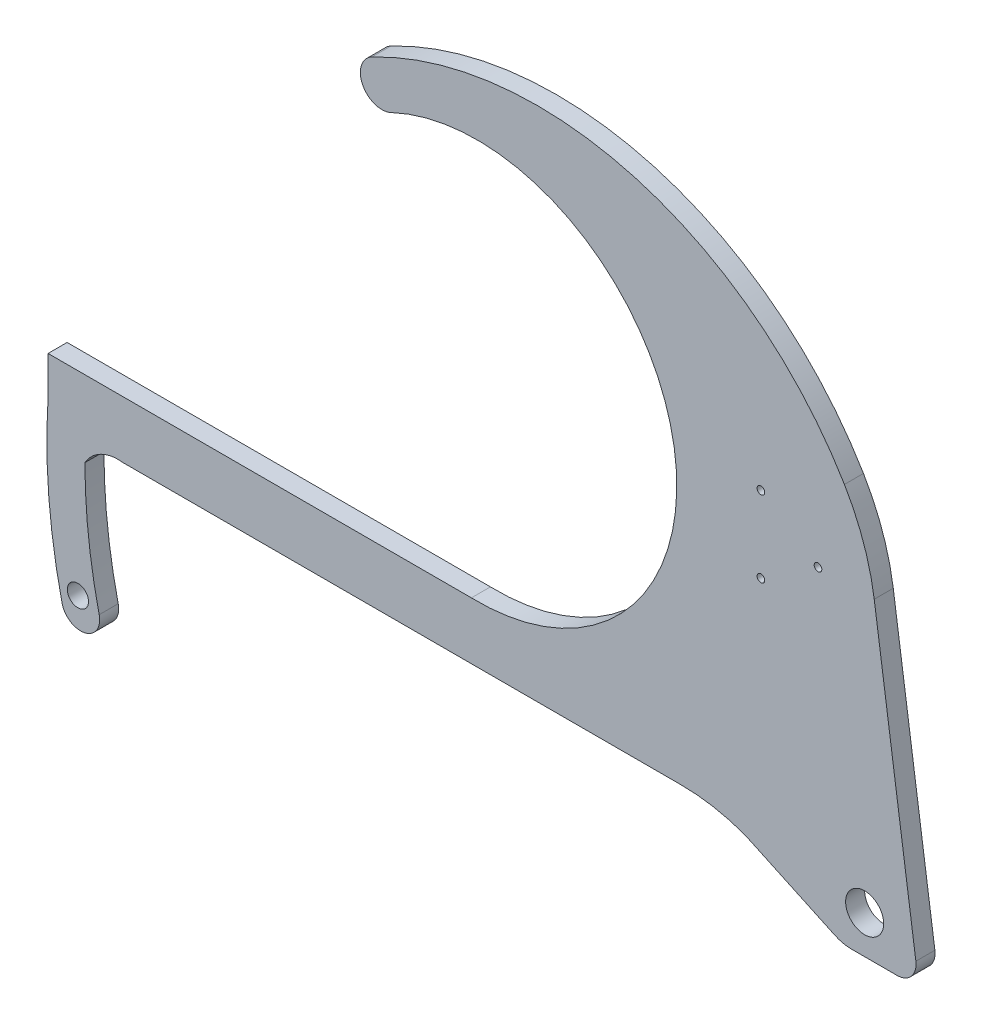
ISO-10303-21;
HEADER;
FILE_DESCRIPTION(('STEP AP214'),'2;1');
FILE_NAME('part.step','',(''),(''),'','','');
FILE_SCHEMA(('AUTOMOTIVE_DESIGN { 1 0 10303 214 1 1 1 1 }'));
ENDSEC;
DATA;
#1=APPLICATION_CONTEXT('core data for automotive mechanical design processes');
#2=APPLICATION_PROTOCOL_DEFINITION('international standard','automotive_design',2000,#1);
#3=PRODUCT_CONTEXT('',#1,'mechanical');
#4=PRODUCT('Part','Part','',(#3));
#5=PRODUCT_RELATED_PRODUCT_CATEGORY('part','',(#4));
#6=PRODUCT_DEFINITION_FORMATION('','',#4);
#7=PRODUCT_DEFINITION_CONTEXT('part definition',#1,'design');
#8=PRODUCT_DEFINITION('design','',#6,#7);
#9=PRODUCT_DEFINITION_SHAPE('','',#8);
#10=(LENGTH_UNIT() NAMED_UNIT(*) SI_UNIT(.MILLI.,.METRE.));
#11=(NAMED_UNIT(*) PLANE_ANGLE_UNIT() SI_UNIT($,.RADIAN.));
#12=(NAMED_UNIT(*) SI_UNIT($,.STERADIAN.) SOLID_ANGLE_UNIT());
#13=UNCERTAINTY_MEASURE_WITH_UNIT(LENGTH_MEASURE(1.E-05),#10,'distance_accuracy_value','');
#14=(GEOMETRIC_REPRESENTATION_CONTEXT(3) GLOBAL_UNCERTAINTY_ASSIGNED_CONTEXT((#13)) GLOBAL_UNIT_ASSIGNED_CONTEXT((#10,
#11,#12)) REPRESENTATION_CONTEXT('',''));
#15=CARTESIAN_POINT('',(0.,0.,0.));
#16=DIRECTION('',(0.,0.,1.));
#17=DIRECTION('',(1.,0.,0.));
#18=AXIS2_PLACEMENT_3D('',#15,#16,#17);
#19=CARTESIAN_POINT('',(-61.2365507117917,-54.7286840070391,6.35));
#20=DIRECTION('',(0.,0.,1.));
#21=DIRECTION('',(1.,0.,0.));
#22=AXIS2_PLACEMENT_3D('',#19,#20,#21);
#23=PLANE('',#22);
#24=CARTESIAN_POINT('',(-34.6176414359985,104.774999999889,6.35));
#25=DIRECTION('',(0.,0.,1.));
#26=DIRECTION('',(1.,0.,0.));
#27=AXIS2_PLACEMENT_3D('',#24,#25,#26);
#28=CIRCLE('',#27,1.27);
#29=CARTESIAN_POINT('',(-33.3476414359985,104.774999999889,6.35));
#30=VERTEX_POINT('',#29);
#31=EDGE_CURVE('E301',#30,#30,#28,.T.);
#32=ORIENTED_EDGE('',*,*,#31,.F.);
#33=EDGE_LOOP('',(#32));
#34=FACE_BOUND('',#33,.T.);
#35=CARTESIAN_POINT('',(-34.6176414359333,79.3749999998886,6.35));
#36=DIRECTION('',(0.,0.,1.));
#37=DIRECTION('',(1.,0.,0.));
#38=AXIS2_PLACEMENT_3D('',#35,#36,#37);
#39=CIRCLE('',#38,1.27);
#40=CARTESIAN_POINT('',(-33.3476414359333,79.3749999998886,6.35));
#41=VERTEX_POINT('',#40);
#42=EDGE_CURVE('E302',#41,#41,#39,.T.);
#43=ORIENTED_EDGE('',*,*,#42,.F.);
#44=EDGE_LOOP('',(#43));
#45=FACE_BOUND('',#44,.T.);
#46=CARTESIAN_POINT('',(-15.5676414359659,92.0749999999375,6.35));
#47=DIRECTION('',(0.,0.,1.));
#48=DIRECTION('',(1.,0.,0.));
#49=AXIS2_PLACEMENT_3D('',#46,#47,#48);
#50=CIRCLE('',#49,1.27);
#51=CARTESIAN_POINT('',(-14.2976414359659,92.0749999999375,6.35));
#52=VERTEX_POINT('',#51);
#53=EDGE_CURVE('E294',#52,#52,#50,.T.);
#54=ORIENTED_EDGE('',*,*,#53,.F.);
#55=EDGE_LOOP('',(#54));
#56=FACE_BOUND('',#55,.T.);
#57=CARTESIAN_POINT('',(-262.5344,-39.5986,6.35));
#58=DIRECTION('',(0.,0.,1.));
#59=DIRECTION('',(1.,0.,0.));
#60=AXIS2_PLACEMENT_3D('',#57,#58,#59);
#61=CIRCLE('',#60,3.5347721646832);
#62=CARTESIAN_POINT('',(-258.999627835317,-39.5986,6.35));
#63=VERTEX_POINT('',#62);
#64=EDGE_CURVE('E253',#63,#63,#61,.T.);
#65=ORIENTED_EDGE('',*,*,#64,.F.);
#66=EDGE_LOOP('',(#65));
#67=FACE_BOUND('',#66,.T.);
#68=DIRECTION('',(-0.140848886420814,0.990031106174961,0.));
#69=VECTOR('',#68,1.);
#70=CARTESIAN_POINT('',(17.0897390908593,-5.45560957122784,6.35));
#71=LINE('',#70,#69);
#72=CARTESIAN_POINT('',(17.0897390908593,-5.45560957122784,6.35));
#73=VERTEX_POINT('',#72);
#74=CARTESIAN_POINT('',(3.19471008208189,92.2129719097271,6.35));
#75=VERTEX_POINT('',#74);
#76=EDGE_CURVE('E273',#73,#75,#71,.T.);
#77=ORIENTED_EDGE('',*,*,#76,.T.);
#78=CARTESIAN_POINT('',(-72.2456602084501,81.4802867644611,6.35));
#79=DIRECTION('',(0.,0.,1.));
#80=DIRECTION('',(1.,0.,0.));
#81=AXIS2_PLACEMENT_3D('',#78,#79,#80);
#82=CIRCLE('',#81,76.2);
#83=CARTESIAN_POINT('',(-6.74624985708387,120.419563126809,6.35));
#84=VERTEX_POINT('',#83);
#85=EDGE_CURVE('E11',#75,#84,#82,.T.);
#86=ORIENTED_EDGE('',*,*,#85,.T.);
#87=CARTESIAN_POINT('',(-109.173629693577,59.5266783034391,6.35));
#88=DIRECTION('',(0.,0.,1.));
#89=DIRECTION('',(1.,0.,0.));
#90=AXIS2_PLACEMENT_3D('',#87,#88,#89);
#91=CIRCLE('',#90,119.160864222619);
#92=CARTESIAN_POINT('',(-164.440692674742,165.095912987211,6.35));
#93=VERTEX_POINT('',#92);
#94=EDGE_CURVE('E271',#84,#93,#91,.T.);
#95=ORIENTED_EDGE('',*,*,#94,.T.);
#96=CARTESIAN_POINT('',(-161.109674878037,158.733117851237,6.35));
#97=DIRECTION('',(0.,0.,1.));
#98=DIRECTION('',(1.,0.,0.));
#99=AXIS2_PLACEMENT_3D('',#96,#97,#98);
#100=CIRCLE('',#99,7.181980333052);
#101=CARTESIAN_POINT('',(-158.02225003957,152.24862485863,6.35));
#102=VERTEX_POINT('',#101);
#103=EDGE_CURVE('E269',#93,#102,#100,.T.);
#104=ORIENTED_EDGE('',*,*,#103,.T.);
#105=CARTESIAN_POINT('',(-129.359674878037,92.0488540109808,6.35));
#106=DIRECTION('',(0.,0.,-1.));
#107=DIRECTION('',(1.,0.,0.));
#108=AXIS2_PLACEMENT_3D('',#105,#106,#107);
#109=CIRCLE('',#108,66.675);
#110=CARTESIAN_POINT('',(-131.226727106275,25.4,6.35));
#111=VERTEX_POINT('',#110);
#112=EDGE_CURVE('E267',#102,#111,#109,.T.);
#113=ORIENTED_EDGE('',*,*,#112,.T.);
#114=DIRECTION('',(-1.,0.,0.));
#115=VECTOR('',#114,1.);
#116=CARTESIAN_POINT('',(-131.226727106275,25.4,6.35));
#117=LINE('',#116,#115);
#118=CARTESIAN_POINT('',(-272.4912,25.4,6.35));
#119=VERTEX_POINT('',#118);
#120=EDGE_CURVE('E265',#111,#119,#117,.T.);
#121=ORIENTED_EDGE('',*,*,#120,.T.);
#122=DIRECTION('',(0.,-1.,0.));
#123=VECTOR('',#122,1.);
#124=CARTESIAN_POINT('',(-272.4912,25.4,6.35));
#125=LINE('',#124,#123);
#126=CARTESIAN_POINT('',(-272.4912,12.7,6.35));
#127=VERTEX_POINT('',#126);
#128=EDGE_CURVE('E263',#119,#127,#125,.T.);
#129=ORIENTED_EDGE('',*,*,#128,.T.);
#130=CARTESIAN_POINT('',(-76.2,0.,6.35));
#131=DIRECTION('',(0.,0.,1.));
#132=DIRECTION('',(1.,0.,0.));
#133=AXIS2_PLACEMENT_3D('',#130,#131,#132);
#134=CIRCLE('',#133,196.701614628452);
#135=CARTESIAN_POINT('',(-267.813472118846,-44.4499999999999,6.35));
#136=VERTEX_POINT('',#135);
#137=EDGE_CURVE('E261',#127,#136,#134,.T.);
#138=ORIENTED_EDGE('',*,*,#137,.T.);
#139=CARTESIAN_POINT('',(-261.625774174921,-43.0145937596868,6.35));
#140=DIRECTION('',(0.,0.,1.));
#141=DIRECTION('',(1.,0.,0.));
#142=AXIS2_PLACEMENT_3D('',#139,#140,#141);
#143=CIRCLE('',#142,6.35200731422564);
#144=CARTESIAN_POINT('',(-255.438076230997,-41.5791875193737,6.35));
#145=VERTEX_POINT('',#144);
#146=EDGE_CURVE('E259',#136,#145,#143,.T.);
#147=ORIENTED_EDGE('',*,*,#146,.T.);
#148=CARTESIAN_POINT('',(-76.2,0.,6.35));
#149=DIRECTION('',(0.,0.,-1.));
#150=DIRECTION('',(1.,0.,0.));
#151=AXIS2_PLACEMENT_3D('',#148,#149,#150);
#152=CIRCLE('',#151,183.9976);
#153=CARTESIAN_POINT('',(-260.1976,0.,6.35));
#154=VERTEX_POINT('',#153);
#155=EDGE_CURVE('E257',#145,#154,#152,.T.);
#156=ORIENTED_EDGE('',*,*,#155,.T.);
#157=CARTESIAN_POINT('',(-249.138313960694,-6.24357207861146,6.35));
#158=DIRECTION('',(0.,0.,-1.));
#159=DIRECTION('',(1.,0.,0.));
#160=AXIS2_PLACEMENT_3D('',#157,#158,#159);
#161=CIRCLE('',#160,12.7);
#162=CARTESIAN_POINT('',(-247.4976,6.35,6.35));
#163=VERTEX_POINT('',#162);
#164=EDGE_CURVE('E255',#154,#163,#161,.T.);
#165=ORIENTED_EDGE('',*,*,#164,.T.);
#166=DIRECTION('',(1.,0.,0.));
#167=VECTOR('',#166,1.);
#168=CARTESIAN_POINT('',(-247.4976,6.35,6.35));
#169=LINE('',#168,#167);
#170=CARTESIAN_POINT('',(-61.6850282208242,6.35,6.35));
#171=VERTEX_POINT('',#170);
#172=EDGE_CURVE('E169',#163,#171,#169,.T.);
#173=ORIENTED_EDGE('',*,*,#172,.T.);
#174=CARTESIAN_POINT('',(-61.2365507117917,-54.7286840070391,6.35));
#175=DIRECTION('',(0.,0.,-1.));
#176=DIRECTION('',(1.,0.,0.));
#177=AXIS2_PLACEMENT_3D('',#174,#175,#176);
#178=CIRCLE('',#177,61.0803304845991);
#179=CARTESIAN_POINT('',(-39.8210292061054,2.47430726743295,6.35));
#180=VERTEX_POINT('',#179);
#181=EDGE_CURVE('E164',#171,#180,#178,.T.);
#182=ORIENTED_EDGE('',*,*,#181,.T.);
#183=DIRECTION('',(0.90630778703665,-0.4226182617407,0.));
#184=VECTOR('',#183,1.);
#185=CARTESIAN_POINT('',(-39.8210292061054,2.47430726743295,6.35));
#186=LINE('',#185,#184);
#187=CARTESIAN_POINT('',(-9.83135196569852,-11.5101088953654,6.35));
#188=VERTEX_POINT('',#187);
#189=EDGE_CURVE('E153',#180,#188,#186,.T.);
#190=ORIENTED_EDGE('',*,*,#189,.T.);
#191=CARTESIAN_POINT('',(-4.46410004159163,0.,6.35));
#192=DIRECTION('',(0.,0.,1.));
#193=DIRECTION('',(1.,0.,0.));
#194=AXIS2_PLACEMENT_3D('',#191,#192,#193);
#195=CIRCLE('',#194,12.7);
#196=CARTESIAN_POINT('',(-4.46410004159165,-12.7,6.35));
#197=VERTEX_POINT('',#196);
#198=EDGE_CURVE('E163',#188,#197,#195,.T.);
#199=ORIENTED_EDGE('',*,*,#198,.T.);
#200=DIRECTION('',(1.,0.,0.));
#201=VECTOR('',#200,1.);
#202=CARTESIAN_POINT('',(-4.46410004159165,-12.7,6.35));
#203=LINE('',#202,#201);
#204=CARTESIAN_POINT('',(10.8030415666482,-12.7,6.35));
#205=VERTEX_POINT('',#204);
#206=EDGE_CURVE('E277',#197,#205,#203,.T.);
#207=ORIENTED_EDGE('',*,*,#206,.T.);
#208=CARTESIAN_POINT('',(10.8030415666482,-6.35,6.35));
#209=DIRECTION('',(0.,0.,1.));
#210=DIRECTION('',(1.,0.,0.));
#211=AXIS2_PLACEMENT_3D('',#208,#209,#210);
#212=CIRCLE('',#211,6.35000000000001);
#213=EDGE_CURVE('E275',#205,#73,#212,.T.);
#214=ORIENTED_EDGE('',*,*,#213,.T.);
#215=EDGE_LOOP('',(#77,#86,#95,#104,#113,#121,#129,#138,#147,#156,#165,#173,#182,#190,#199,#207,#214));
#216=FACE_BOUND('',#215,.T.);
#217=CARTESIAN_POINT('',(0.,0.,6.35));
#218=DIRECTION('',(0.,0.,1.));
#219=DIRECTION('',(1.,0.,0.));
#220=AXIS2_PLACEMENT_3D('',#217,#218,#219);
#221=CIRCLE('',#220,6.35);
#222=CARTESIAN_POINT('',(6.35,0.,6.35));
#223=VERTEX_POINT('',#222);
#224=EDGE_CURVE('E283',#223,#223,#221,.T.);
#225=ORIENTED_EDGE('',*,*,#224,.F.);
#226=EDGE_LOOP('',(#225));
#227=FACE_BOUND('',#226,.T.);
#228=ADVANCED_FACE('F34',(#34,#45,#56,#67,#216,#227),#23,.T.);
#229=CARTESIAN_POINT('',(-61.2365507117917,-54.7286840070391,0.));
#230=DIRECTION('',(0.,0.,1.));
#231=DIRECTION('',(1.,0.,0.));
#232=AXIS2_PLACEMENT_3D('',#229,#230,#231);
#233=PLANE('',#232);
#234=CARTESIAN_POINT('',(-34.6176414359985,104.774999999889,0.));
#235=DIRECTION('',(0.,0.,1.));
#236=DIRECTION('',(1.,0.,0.));
#237=AXIS2_PLACEMENT_3D('',#234,#235,#236);
#238=CIRCLE('',#237,1.27);
#239=CARTESIAN_POINT('',(-33.3476414359985,104.774999999889,0.));
#240=VERTEX_POINT('',#239);
#241=EDGE_CURVE('E297',#240,#240,#238,.F.);
#242=ORIENTED_EDGE('',*,*,#241,.F.);
#243=EDGE_LOOP('',(#242));
#244=FACE_BOUND('',#243,.T.);
#245=CARTESIAN_POINT('',(-34.6176414359333,79.3749999998886,0.));
#246=DIRECTION('',(0.,0.,1.));
#247=DIRECTION('',(1.,0.,0.));
#248=AXIS2_PLACEMENT_3D('',#245,#246,#247);
#249=CIRCLE('',#248,1.27);
#250=CARTESIAN_POINT('',(-33.3476414359333,79.3749999998886,0.));
#251=VERTEX_POINT('',#250);
#252=EDGE_CURVE('E298',#251,#251,#249,.F.);
#253=ORIENTED_EDGE('',*,*,#252,.F.);
#254=EDGE_LOOP('',(#253));
#255=FACE_BOUND('',#254,.T.);
#256=CARTESIAN_POINT('',(-15.5676414359659,92.0749999999375,0.));
#257=DIRECTION('',(0.,0.,1.));
#258=DIRECTION('',(1.,0.,0.));
#259=AXIS2_PLACEMENT_3D('',#256,#257,#258);
#260=CIRCLE('',#259,1.27);
#261=CARTESIAN_POINT('',(-14.2976414359659,92.0749999999375,0.));
#262=VERTEX_POINT('',#261);
#263=EDGE_CURVE('E289',#262,#262,#260,.F.);
#264=ORIENTED_EDGE('',*,*,#263,.F.);
#265=EDGE_LOOP('',(#264));
#266=FACE_BOUND('',#265,.T.);
#267=CARTESIAN_POINT('',(-109.173629693577,59.5266783034391,0.));
#268=DIRECTION('',(0.,0.,1.));
#269=DIRECTION('',(1.,0.,0.));
#270=AXIS2_PLACEMENT_3D('',#267,#268,#269);
#271=CIRCLE('',#270,119.160864222619);
#272=CARTESIAN_POINT('',(-6.74624985708387,120.419563126809,0.));
#273=VERTEX_POINT('',#272);
#274=CARTESIAN_POINT('',(-164.440692674742,165.095912987211,0.));
#275=VERTEX_POINT('',#274);
#276=EDGE_CURVE('E240',#273,#275,#271,.T.);
#277=ORIENTED_EDGE('',*,*,#276,.F.);
#278=CARTESIAN_POINT('',(-72.2456602084501,81.4802867644611,0.));
#279=DIRECTION('',(0.,0.,1.));
#280=DIRECTION('',(1.,0.,0.));
#281=AXIS2_PLACEMENT_3D('',#278,#279,#280);
#282=CIRCLE('',#281,76.2);
#283=CARTESIAN_POINT('',(3.19471008208189,92.2129719097271,0.));
#284=VERTEX_POINT('',#283);
#285=EDGE_CURVE('E56',#273,#284,#282,.F.);
#286=ORIENTED_EDGE('',*,*,#285,.T.);
#287=DIRECTION('',(-0.140848886420814,0.990031106174961,0.));
#288=VECTOR('',#287,1.);
#289=CARTESIAN_POINT('',(17.0897390908593,-5.45560957122784,0.));
#290=LINE('',#289,#288);
#291=CARTESIAN_POINT('',(17.0897390908593,-5.45560957122784,0.));
#292=VERTEX_POINT('',#291);
#293=EDGE_CURVE('E242',#292,#284,#290,.T.);
#294=ORIENTED_EDGE('',*,*,#293,.F.);
#295=CARTESIAN_POINT('',(10.8030415666482,-6.35,0.));
#296=DIRECTION('',(0.,0.,1.));
#297=DIRECTION('',(1.,0.,0.));
#298=AXIS2_PLACEMENT_3D('',#295,#296,#297);
#299=CIRCLE('',#298,6.35000000000001);
#300=CARTESIAN_POINT('',(10.8030415666482,-12.7,0.));
#301=VERTEX_POINT('',#300);
#302=EDGE_CURVE('E244',#301,#292,#299,.T.);
#303=ORIENTED_EDGE('',*,*,#302,.F.);
#304=DIRECTION('',(1.,0.,0.));
#305=VECTOR('',#304,1.);
#306=CARTESIAN_POINT('',(-4.46410004159165,-12.7,0.));
#307=LINE('',#306,#305);
#308=CARTESIAN_POINT('',(-4.46410004159165,-12.7,0.));
#309=VERTEX_POINT('',#308);
#310=EDGE_CURVE('E246',#309,#301,#307,.T.);
#311=ORIENTED_EDGE('',*,*,#310,.F.);
#312=CARTESIAN_POINT('',(-4.46410004159163,0.,0.));
#313=DIRECTION('',(0.,0.,1.));
#314=DIRECTION('',(1.,0.,0.));
#315=AXIS2_PLACEMENT_3D('',#312,#313,#314);
#316=CIRCLE('',#315,12.7);
#317=CARTESIAN_POINT('',(-9.83135196569852,-11.5101088953654,0.));
#318=VERTEX_POINT('',#317);
#319=EDGE_CURVE('E248',#318,#309,#316,.T.);
#320=ORIENTED_EDGE('',*,*,#319,.F.);
#321=DIRECTION('',(0.90630778703665,-0.4226182617407,0.));
#322=VECTOR('',#321,1.);
#323=CARTESIAN_POINT('',(-39.8210292061054,2.47430726743295,0.));
#324=LINE('',#323,#322);
#325=CARTESIAN_POINT('',(-39.8210292061054,2.47430726743295,0.));
#326=VERTEX_POINT('',#325);
#327=EDGE_CURVE('E250',#326,#318,#324,.T.);
#328=ORIENTED_EDGE('',*,*,#327,.F.);
#329=CARTESIAN_POINT('',(-61.2365507117917,-54.7286840070391,0.));
#330=DIRECTION('',(0.,0.,-1.));
#331=DIRECTION('',(1.,0.,0.));
#332=AXIS2_PLACEMENT_3D('',#329,#330,#331);
#333=CIRCLE('',#332,61.0803304845991);
#334=CARTESIAN_POINT('',(-61.6850282208242,6.35,0.));
#335=VERTEX_POINT('',#334);
#336=EDGE_CURVE('E177',#335,#326,#333,.T.);
#337=ORIENTED_EDGE('',*,*,#336,.F.);
#338=DIRECTION('',(1.,0.,0.));
#339=VECTOR('',#338,1.);
#340=CARTESIAN_POINT('',(-247.4976,6.35,0.));
#341=LINE('',#340,#339);
#342=CARTESIAN_POINT('',(-247.4976,6.35,0.));
#343=VERTEX_POINT('',#342);
#344=EDGE_CURVE('E173',#343,#335,#341,.T.);
#345=ORIENTED_EDGE('',*,*,#344,.F.);
#346=CARTESIAN_POINT('',(-249.138313960694,-6.24357207861146,0.));
#347=DIRECTION('',(0.,0.,-1.));
#348=DIRECTION('',(1.,0.,0.));
#349=AXIS2_PLACEMENT_3D('',#346,#347,#348);
#350=CIRCLE('',#349,12.7);
#351=CARTESIAN_POINT('',(-260.1976,0.,0.));
#352=VERTEX_POINT('',#351);
#353=EDGE_CURVE('E224',#352,#343,#350,.T.);
#354=ORIENTED_EDGE('',*,*,#353,.F.);
#355=CARTESIAN_POINT('',(-76.2,0.,0.));
#356=DIRECTION('',(0.,0.,-1.));
#357=DIRECTION('',(1.,0.,0.));
#358=AXIS2_PLACEMENT_3D('',#355,#356,#357);
#359=CIRCLE('',#358,183.9976);
#360=CARTESIAN_POINT('',(-255.438076230997,-41.5791875193737,0.));
#361=VERTEX_POINT('',#360);
#362=EDGE_CURVE('E226',#361,#352,#359,.T.);
#363=ORIENTED_EDGE('',*,*,#362,.F.);
#364=CARTESIAN_POINT('',(-261.625774174921,-43.0145937596868,0.));
#365=DIRECTION('',(0.,0.,1.));
#366=DIRECTION('',(1.,0.,0.));
#367=AXIS2_PLACEMENT_3D('',#364,#365,#366);
#368=CIRCLE('',#367,6.35200731422564);
#369=CARTESIAN_POINT('',(-267.813472118846,-44.4499999999999,0.));
#370=VERTEX_POINT('',#369);
#371=EDGE_CURVE('E228',#370,#361,#368,.T.);
#372=ORIENTED_EDGE('',*,*,#371,.F.);
#373=CARTESIAN_POINT('',(-76.2,0.,0.));
#374=DIRECTION('',(0.,0.,1.));
#375=DIRECTION('',(1.,0.,0.));
#376=AXIS2_PLACEMENT_3D('',#373,#374,#375);
#377=CIRCLE('',#376,196.701614628452);
#378=CARTESIAN_POINT('',(-272.4912,12.7,0.));
#379=VERTEX_POINT('',#378);
#380=EDGE_CURVE('E230',#379,#370,#377,.T.);
#381=ORIENTED_EDGE('',*,*,#380,.F.);
#382=DIRECTION('',(0.,-1.,0.));
#383=VECTOR('',#382,1.);
#384=CARTESIAN_POINT('',(-272.4912,25.4,0.));
#385=LINE('',#384,#383);
#386=CARTESIAN_POINT('',(-272.4912,25.4,0.));
#387=VERTEX_POINT('',#386);
#388=EDGE_CURVE('E232',#387,#379,#385,.T.);
#389=ORIENTED_EDGE('',*,*,#388,.F.);
#390=DIRECTION('',(-1.,0.,0.));
#391=VECTOR('',#390,1.);
#392=CARTESIAN_POINT('',(-131.226727106275,25.4,0.));
#393=LINE('',#392,#391);
#394=CARTESIAN_POINT('',(-131.226727106275,25.4,0.));
#395=VERTEX_POINT('',#394);
#396=EDGE_CURVE('E234',#395,#387,#393,.T.);
#397=ORIENTED_EDGE('',*,*,#396,.F.);
#398=CARTESIAN_POINT('',(-129.359674878037,92.0488540109808,0.));
#399=DIRECTION('',(0.,0.,-1.));
#400=DIRECTION('',(1.,0.,0.));
#401=AXIS2_PLACEMENT_3D('',#398,#399,#400);
#402=CIRCLE('',#401,66.675);
#403=CARTESIAN_POINT('',(-158.02225003957,152.24862485863,0.));
#404=VERTEX_POINT('',#403);
#405=EDGE_CURVE('E236',#404,#395,#402,.T.);
#406=ORIENTED_EDGE('',*,*,#405,.F.);
#407=CARTESIAN_POINT('',(-161.109674878037,158.733117851237,0.));
#408=DIRECTION('',(0.,0.,1.));
#409=DIRECTION('',(1.,0.,0.));
#410=AXIS2_PLACEMENT_3D('',#407,#408,#409);
#411=CIRCLE('',#410,7.181980333052);
#412=EDGE_CURVE('E238',#275,#404,#411,.T.);
#413=ORIENTED_EDGE('',*,*,#412,.F.);
#414=EDGE_LOOP('',(#277,#286,#294,#303,#311,#320,#328,#337,#345,#354,#363,#372,#381,#389,#397,
#406,#413));
#415=FACE_BOUND('',#414,.T.);
#416=CARTESIAN_POINT('',(-262.5344,-39.5986,0.));
#417=DIRECTION('',(0.,0.,1.));
#418=DIRECTION('',(1.,0.,0.));
#419=AXIS2_PLACEMENT_3D('',#416,#417,#418);
#420=CIRCLE('',#419,3.5347721646832);
#421=CARTESIAN_POINT('',(-258.999627835317,-39.5986,0.));
#422=VERTEX_POINT('',#421);
#423=EDGE_CURVE('E280',#422,#422,#420,.T.);
#424=ORIENTED_EDGE('',*,*,#423,.T.);
#425=EDGE_LOOP('',(#424));
#426=FACE_BOUND('',#425,.T.);
#427=CARTESIAN_POINT('',(0.,0.,0.));
#428=DIRECTION('',(0.,0.,1.));
#429=DIRECTION('',(1.,0.,0.));
#430=AXIS2_PLACEMENT_3D('',#427,#428,#429);
#431=CIRCLE('',#430,6.35);
#432=CARTESIAN_POINT('',(6.35,0.,0.));
#433=VERTEX_POINT('',#432);
#434=EDGE_CURVE('E286',#433,#433,#431,.T.);
#435=ORIENTED_EDGE('',*,*,#434,.T.);
#436=EDGE_LOOP('',(#435));
#437=FACE_BOUND('',#436,.T.);
#438=ADVANCED_FACE('F315',(#244,#255,#266,#415,#426,#437),#233,.F.);
#439=CARTESIAN_POINT('',(-61.2365507117917,-54.7286840070391,6.35));
#440=DIRECTION('',(0.,0.,-1.));
#441=DIRECTION('',(-1.,0.,0.));
#442=AXIS2_PLACEMENT_3D('',#439,#440,#441);
#443=CYLINDRICAL_SURFACE('',#442,61.0803304845991);
#444=ORIENTED_EDGE('',*,*,#336,.T.);
#445=DIRECTION('',(0.,0.,-1.));
#446=VECTOR('',#445,1.);
#447=CARTESIAN_POINT('',(-39.8210292061054,2.47430726743295,6.35));
#448=LINE('',#447,#446);
#449=EDGE_CURVE('E157',#180,#326,#448,.T.);
#450=ORIENTED_EDGE('',*,*,#449,.F.);
#451=ORIENTED_EDGE('',*,*,#181,.F.);
#452=DIRECTION('',(0.,0.,-1.));
#453=VECTOR('',#452,1.);
#454=CARTESIAN_POINT('',(-61.6850282208242,6.35,6.35));
#455=LINE('',#454,#453);
#456=EDGE_CURVE('E221',#171,#335,#455,.T.);
#457=ORIENTED_EDGE('',*,*,#456,.T.);
#458=EDGE_LOOP('',(#444,#450,#451,#457));
#459=FACE_BOUND('',#458,.T.);
#460=ADVANCED_FACE('F175',(#459),#443,.F.);
#461=CARTESIAN_POINT('',(-39.8210292061054,2.47430726743295,6.35));
#462=DIRECTION('',(0.4226182617407,0.90630778703665,0.));
#463=DIRECTION('',(-0.90630778703665,0.4226182617407,0.));
#464=AXIS2_PLACEMENT_3D('',#461,#462,#463);
#465=PLANE('',#464);
#466=ORIENTED_EDGE('',*,*,#327,.T.);
#467=DIRECTION('',(0.,0.,-1.));
#468=VECTOR('',#467,1.);
#469=CARTESIAN_POINT('',(-9.83135196569852,-11.5101088953654,6.35));
#470=LINE('',#469,#468);
#471=EDGE_CURVE('E160',#188,#318,#470,.T.);
#472=ORIENTED_EDGE('',*,*,#471,.F.);
#473=ORIENTED_EDGE('',*,*,#189,.F.);
#474=ORIENTED_EDGE('',*,*,#449,.T.);
#475=EDGE_LOOP('',(#466,#472,#473,#474));
#476=FACE_BOUND('',#475,.T.);
#477=ADVANCED_FACE('F155',(#476),#465,.F.);
#478=CARTESIAN_POINT('',(-4.46410004159163,0.,6.35));
#479=DIRECTION('',(0.,0.,-1.));
#480=DIRECTION('',(-1.,0.,0.));
#481=AXIS2_PLACEMENT_3D('',#478,#479,#480);
#482=CYLINDRICAL_SURFACE('',#481,12.7);
#483=ORIENTED_EDGE('',*,*,#319,.T.);
#484=DIRECTION('',(0.,0.,-1.));
#485=VECTOR('',#484,1.);
#486=CARTESIAN_POINT('',(-4.46410004159165,-12.7,6.35));
#487=LINE('',#486,#485);
#488=EDGE_CURVE('E182',#197,#309,#487,.T.);
#489=ORIENTED_EDGE('',*,*,#488,.F.);
#490=ORIENTED_EDGE('',*,*,#198,.F.);
#491=ORIENTED_EDGE('',*,*,#471,.T.);
#492=EDGE_LOOP('',(#483,#489,#490,#491));
#493=FACE_BOUND('',#492,.T.);
#494=ADVANCED_FACE('F397',(#493),#482,.T.);
#495=CARTESIAN_POINT('',(-4.46410004159165,-12.7,6.35));
#496=DIRECTION('',(0.,1.,0.));
#497=DIRECTION('',(-1.,0.,0.));
#498=AXIS2_PLACEMENT_3D('',#495,#496,#497);
#499=PLANE('',#498);
#500=ORIENTED_EDGE('',*,*,#310,.T.);
#501=DIRECTION('',(0.,0.,-1.));
#502=VECTOR('',#501,1.);
#503=CARTESIAN_POINT('',(10.8030415666482,-12.7,6.35));
#504=LINE('',#503,#502);
#505=EDGE_CURVE('E188',#205,#301,#504,.T.);
#506=ORIENTED_EDGE('',*,*,#505,.F.);
#507=ORIENTED_EDGE('',*,*,#206,.F.);
#508=ORIENTED_EDGE('',*,*,#488,.T.);
#509=EDGE_LOOP('',(#500,#506,#507,#508));
#510=FACE_BOUND('',#509,.T.);
#511=ADVANCED_FACE('F393',(#510),#499,.F.);
#512=CARTESIAN_POINT('',(10.8030415666482,-6.35,6.35));
#513=DIRECTION('',(0.,0.,-1.));
#514=DIRECTION('',(-1.,0.,0.));
#515=AXIS2_PLACEMENT_3D('',#512,#513,#514);
#516=CYLINDRICAL_SURFACE('',#515,6.35000000000001);
#517=ORIENTED_EDGE('',*,*,#302,.T.);
#518=DIRECTION('',(0.,0.,-1.));
#519=VECTOR('',#518,1.);
#520=CARTESIAN_POINT('',(17.0897390908593,-5.45560957122784,6.35));
#521=LINE('',#520,#519);
#522=EDGE_CURVE('E191',#73,#292,#521,.T.);
#523=ORIENTED_EDGE('',*,*,#522,.F.);
#524=ORIENTED_EDGE('',*,*,#213,.F.);
#525=ORIENTED_EDGE('',*,*,#505,.T.);
#526=EDGE_LOOP('',(#517,#523,#524,#525));
#527=FACE_BOUND('',#526,.T.);
#528=ADVANCED_FACE('F390',(#527),#516,.T.);
#529=CARTESIAN_POINT('',(17.0897390908593,-5.45560957122784,6.35));
#530=DIRECTION('',(-0.990031106174961,-0.140848886420814,0.));
#531=DIRECTION('',(0.140848886420814,-0.990031106174961,0.));
#532=AXIS2_PLACEMENT_3D('',#529,#530,#531);
#533=PLANE('',#532);
#534=ORIENTED_EDGE('',*,*,#293,.T.);
#535=DIRECTION('',(0.,0.,-1.));
#536=VECTOR('',#535,1.);
#537=CARTESIAN_POINT('',(3.1947100820819,92.212971909727,6.35));
#538=LINE('',#537,#536);
#539=EDGE_CURVE('E42',#284,#75,#538,.F.);
#540=ORIENTED_EDGE('',*,*,#539,.T.);
#541=ORIENTED_EDGE('',*,*,#76,.F.);
#542=ORIENTED_EDGE('',*,*,#522,.T.);
#543=EDGE_LOOP('',(#534,#540,#541,#542));
#544=FACE_BOUND('',#543,.T.);
#545=ADVANCED_FACE('F386',(#544),#533,.F.);
#546=CARTESIAN_POINT('',(-109.173629693577,59.5266783034391,6.35));
#547=DIRECTION('',(0.,0.,-1.));
#548=DIRECTION('',(-1.,0.,0.));
#549=AXIS2_PLACEMENT_3D('',#546,#547,#548);
#550=CYLINDRICAL_SURFACE('',#549,119.160864222619);
#551=ORIENTED_EDGE('',*,*,#94,.F.);
#552=DIRECTION('',(0.,0.,-1.));
#553=VECTOR('',#552,1.);
#554=CARTESIAN_POINT('',(-6.74624985708387,120.419563126809,6.35));
#555=LINE('',#554,#553);
#556=EDGE_CURVE('E178',#84,#273,#555,.T.);
#557=ORIENTED_EDGE('',*,*,#556,.T.);
#558=ORIENTED_EDGE('',*,*,#276,.T.);
#559=DIRECTION('',(0.,0.,-1.));
#560=VECTOR('',#559,1.);
#561=CARTESIAN_POINT('',(-164.440692674742,165.095912987211,6.35));
#562=LINE('',#561,#560);
#563=EDGE_CURVE('E194',#93,#275,#562,.T.);
#564=ORIENTED_EDGE('',*,*,#563,.F.);
#565=EDGE_LOOP('',(#551,#557,#558,#564));
#566=FACE_BOUND('',#565,.T.);
#567=ADVANCED_FACE('F382',(#566),#550,.T.);
#568=CARTESIAN_POINT('',(-161.109674878037,158.733117851237,6.35));
#569=DIRECTION('',(0.,0.,-1.));
#570=DIRECTION('',(-1.,0.,0.));
#571=AXIS2_PLACEMENT_3D('',#568,#569,#570);
#572=CYLINDRICAL_SURFACE('',#571,7.181980333052);
#573=ORIENTED_EDGE('',*,*,#412,.T.);
#574=DIRECTION('',(0.,0.,-1.));
#575=VECTOR('',#574,1.);
#576=CARTESIAN_POINT('',(-158.02225003957,152.24862485863,6.35));
#577=LINE('',#576,#575);
#578=EDGE_CURVE('E197',#102,#404,#577,.T.);
#579=ORIENTED_EDGE('',*,*,#578,.F.);
#580=ORIENTED_EDGE('',*,*,#103,.F.);
#581=ORIENTED_EDGE('',*,*,#563,.T.);
#582=EDGE_LOOP('',(#573,#579,#580,#581));
#583=FACE_BOUND('',#582,.T.);
#584=ADVANCED_FACE('F378',(#583),#572,.T.);
#585=CARTESIAN_POINT('',(-129.359674878037,92.0488540109808,6.35));
#586=DIRECTION('',(0.,0.,-1.));
#587=DIRECTION('',(-1.,0.,0.));
#588=AXIS2_PLACEMENT_3D('',#585,#586,#587);
#589=CYLINDRICAL_SURFACE('',#588,66.675);
#590=ORIENTED_EDGE('',*,*,#405,.T.);
#591=DIRECTION('',(0.,0.,-1.));
#592=VECTOR('',#591,1.);
#593=CARTESIAN_POINT('',(-131.226727106275,25.4,6.35));
#594=LINE('',#593,#592);
#595=EDGE_CURVE('E200',#111,#395,#594,.T.);
#596=ORIENTED_EDGE('',*,*,#595,.F.);
#597=ORIENTED_EDGE('',*,*,#112,.F.);
#598=ORIENTED_EDGE('',*,*,#578,.T.);
#599=EDGE_LOOP('',(#590,#596,#597,#598));
#600=FACE_BOUND('',#599,.T.);
#601=ADVANCED_FACE('F374',(#600),#589,.F.);
#602=CARTESIAN_POINT('',(-131.226727106275,25.4,6.35));
#603=DIRECTION('',(0.,-1.,0.));
#604=DIRECTION('',(0.,0.,-1.));
#605=AXIS2_PLACEMENT_3D('',#602,#603,#604);
#606=PLANE('',#605);
#607=ORIENTED_EDGE('',*,*,#396,.T.);
#608=DIRECTION('',(0.,0.,-1.));
#609=VECTOR('',#608,1.);
#610=CARTESIAN_POINT('',(-272.4912,25.4,6.35));
#611=LINE('',#610,#609);
#612=EDGE_CURVE('E203',#119,#387,#611,.T.);
#613=ORIENTED_EDGE('',*,*,#612,.F.);
#614=ORIENTED_EDGE('',*,*,#120,.F.);
#615=ORIENTED_EDGE('',*,*,#595,.T.);
#616=EDGE_LOOP('',(#607,#613,#614,#615));
#617=FACE_BOUND('',#616,.T.);
#618=ADVANCED_FACE('F370',(#617),#606,.F.);
#619=CARTESIAN_POINT('',(-272.4912,25.4,6.35));
#620=DIRECTION('',(1.,0.,0.));
#621=DIRECTION('',(0.,0.,-1.));
#622=AXIS2_PLACEMENT_3D('',#619,#620,#621);
#623=PLANE('',#622);
#624=ORIENTED_EDGE('',*,*,#388,.T.);
#625=DIRECTION('',(0.,0.,-1.));
#626=VECTOR('',#625,1.);
#627=CARTESIAN_POINT('',(-272.4912,12.7,6.35));
#628=LINE('',#627,#626);
#629=EDGE_CURVE('E206',#127,#379,#628,.T.);
#630=ORIENTED_EDGE('',*,*,#629,.F.);
#631=ORIENTED_EDGE('',*,*,#128,.F.);
#632=ORIENTED_EDGE('',*,*,#612,.T.);
#633=EDGE_LOOP('',(#624,#630,#631,#632));
#634=FACE_BOUND('',#633,.T.);
#635=ADVANCED_FACE('F366',(#634),#623,.F.);
#636=CARTESIAN_POINT('',(-76.2,0.,6.35));
#637=DIRECTION('',(0.,0.,-1.));
#638=DIRECTION('',(-1.,0.,0.));
#639=AXIS2_PLACEMENT_3D('',#636,#637,#638);
#640=CYLINDRICAL_SURFACE('',#639,196.701614628452);
#641=ORIENTED_EDGE('',*,*,#380,.T.);
#642=DIRECTION('',(0.,0.,-1.));
#643=VECTOR('',#642,1.);
#644=CARTESIAN_POINT('',(-267.813472118846,-44.4499999999999,6.35));
#645=LINE('',#644,#643);
#646=EDGE_CURVE('E209',#136,#370,#645,.T.);
#647=ORIENTED_EDGE('',*,*,#646,.F.);
#648=ORIENTED_EDGE('',*,*,#137,.F.);
#649=ORIENTED_EDGE('',*,*,#629,.T.);
#650=EDGE_LOOP('',(#641,#647,#648,#649));
#651=FACE_BOUND('',#650,.T.);
#652=ADVANCED_FACE('F362',(#651),#640,.T.);
#653=CARTESIAN_POINT('',(-261.625774174921,-43.0145937596868,6.35));
#654=DIRECTION('',(0.,0.,-1.));
#655=DIRECTION('',(-1.,0.,0.));
#656=AXIS2_PLACEMENT_3D('',#653,#654,#655);
#657=CYLINDRICAL_SURFACE('',#656,6.35200731422564);
#658=ORIENTED_EDGE('',*,*,#371,.T.);
#659=DIRECTION('',(0.,0.,-1.));
#660=VECTOR('',#659,1.);
#661=CARTESIAN_POINT('',(-255.438076230997,-41.5791875193737,6.35));
#662=LINE('',#661,#660);
#663=EDGE_CURVE('E212',#145,#361,#662,.T.);
#664=ORIENTED_EDGE('',*,*,#663,.F.);
#665=ORIENTED_EDGE('',*,*,#146,.F.);
#666=ORIENTED_EDGE('',*,*,#646,.T.);
#667=EDGE_LOOP('',(#658,#664,#665,#666));
#668=FACE_BOUND('',#667,.T.);
#669=ADVANCED_FACE('F358',(#668),#657,.T.);
#670=CARTESIAN_POINT('',(-76.2,0.,6.35));
#671=DIRECTION('',(0.,0.,-1.));
#672=DIRECTION('',(-1.,0.,0.));
#673=AXIS2_PLACEMENT_3D('',#670,#671,#672);
#674=CYLINDRICAL_SURFACE('',#673,183.9976);
#675=ORIENTED_EDGE('',*,*,#362,.T.);
#676=DIRECTION('',(0.,0.,-1.));
#677=VECTOR('',#676,1.);
#678=CARTESIAN_POINT('',(-260.1976,0.,6.35));
#679=LINE('',#678,#677);
#680=EDGE_CURVE('E215',#154,#352,#679,.T.);
#681=ORIENTED_EDGE('',*,*,#680,.F.);
#682=ORIENTED_EDGE('',*,*,#155,.F.);
#683=ORIENTED_EDGE('',*,*,#663,.T.);
#684=EDGE_LOOP('',(#675,#681,#682,#683));
#685=FACE_BOUND('',#684,.T.);
#686=ADVANCED_FACE('F354',(#685),#674,.F.);
#687=CARTESIAN_POINT('',(-249.138313960694,-6.24357207861146,6.35));
#688=DIRECTION('',(0.,0.,-1.));
#689=DIRECTION('',(-1.,0.,0.));
#690=AXIS2_PLACEMENT_3D('',#687,#688,#689);
#691=CYLINDRICAL_SURFACE('',#690,12.7);
#692=ORIENTED_EDGE('',*,*,#353,.T.);
#693=DIRECTION('',(0.,0.,-1.));
#694=VECTOR('',#693,1.);
#695=CARTESIAN_POINT('',(-247.4976,6.35,6.35));
#696=LINE('',#695,#694);
#697=EDGE_CURVE('E218',#163,#343,#696,.T.);
#698=ORIENTED_EDGE('',*,*,#697,.F.);
#699=ORIENTED_EDGE('',*,*,#164,.F.);
#700=ORIENTED_EDGE('',*,*,#680,.T.);
#701=EDGE_LOOP('',(#692,#698,#699,#700));
#702=FACE_BOUND('',#701,.T.);
#703=ADVANCED_FACE('F350',(#702),#691,.F.);
#704=CARTESIAN_POINT('',(-247.4976,6.35,6.35));
#705=DIRECTION('',(0.,1.,0.));
#706=DIRECTION('',(-1.,0.,0.));
#707=AXIS2_PLACEMENT_3D('',#704,#705,#706);
#708=PLANE('',#707);
#709=ORIENTED_EDGE('',*,*,#344,.T.);
#710=ORIENTED_EDGE('',*,*,#456,.F.);
#711=ORIENTED_EDGE('',*,*,#172,.F.);
#712=ORIENTED_EDGE('',*,*,#697,.T.);
#713=EDGE_LOOP('',(#709,#710,#711,#712));
#714=FACE_BOUND('',#713,.T.);
#715=ADVANCED_FACE('F327',(#714),#708,.F.);
#716=CARTESIAN_POINT('',(-262.5344,-39.5986,6.35));
#717=DIRECTION('',(0.,0.,-1.));
#718=DIRECTION('',(-1.,0.,0.));
#719=AXIS2_PLACEMENT_3D('',#716,#717,#718);
#720=CYLINDRICAL_SURFACE('',#719,3.5347721646832);
#721=ORIENTED_EDGE('',*,*,#64,.T.);
#722=EDGE_LOOP('',(#721));
#723=FACE_BOUND('',#722,.T.);
#724=ORIENTED_EDGE('',*,*,#423,.F.);
#725=EDGE_LOOP('',(#724));
#726=FACE_BOUND('',#725,.T.);
#727=ADVANCED_FACE('F323',(#723,#726),#720,.F.);
#728=CARTESIAN_POINT('',(0.,0.,6.35));
#729=DIRECTION('',(0.,0.,-1.));
#730=DIRECTION('',(-1.,0.,0.));
#731=AXIS2_PLACEMENT_3D('',#728,#729,#730);
#732=CYLINDRICAL_SURFACE('',#731,6.35);
#733=ORIENTED_EDGE('',*,*,#224,.T.);
#734=EDGE_LOOP('',(#733));
#735=FACE_BOUND('',#734,.T.);
#736=ORIENTED_EDGE('',*,*,#434,.F.);
#737=EDGE_LOOP('',(#736));
#738=FACE_BOUND('',#737,.T.);
#739=ADVANCED_FACE('F326',(#735,#738),#732,.F.);
#740=CARTESIAN_POINT('',(-72.2456602084501,81.4802867644611,6.35));
#741=DIRECTION('',(0.,0.,-1.));
#742=DIRECTION('',(-1.,0.,0.));
#743=AXIS2_PLACEMENT_3D('',#740,#741,#742);
#744=CYLINDRICAL_SURFACE('',#743,76.2);
#745=ORIENTED_EDGE('',*,*,#85,.F.);
#746=ORIENTED_EDGE('',*,*,#539,.F.);
#747=ORIENTED_EDGE('',*,*,#285,.F.);
#748=ORIENTED_EDGE('',*,*,#556,.F.);
#749=EDGE_LOOP('',(#745,#746,#747,#748));
#750=FACE_BOUND('',#749,.T.);
#751=ADVANCED_FACE('F36',(#750),#744,.T.);
#752=CARTESIAN_POINT('',(-15.5676414359659,92.0749999999375,-0.00100000000000013));
#753=DIRECTION('',(0.,0.,1.));
#754=DIRECTION('',(1.,0.,0.));
#755=AXIS2_PLACEMENT_3D('',#752,#753,#754);
#756=CYLINDRICAL_SURFACE('',#755,1.27);
#757=ORIENTED_EDGE('',*,*,#53,.T.);
#758=EDGE_LOOP('',(#757));
#759=FACE_BOUND('',#758,.T.);
#760=ORIENTED_EDGE('',*,*,#263,.T.);
#761=EDGE_LOOP('',(#760));
#762=FACE_BOUND('',#761,.T.);
#763=ADVANCED_FACE('F343',(#759,#762),#756,.F.);
#764=CARTESIAN_POINT('',(-34.6176414359333,79.3749999998886,-0.00100000000000013));
#765=DIRECTION('',(0.,0.,1.));
#766=DIRECTION('',(1.,0.,0.));
#767=AXIS2_PLACEMENT_3D('',#764,#765,#766);
#768=CYLINDRICAL_SURFACE('',#767,1.27);
#769=ORIENTED_EDGE('',*,*,#42,.T.);
#770=EDGE_LOOP('',(#769));
#771=FACE_BOUND('',#770,.T.);
#772=ORIENTED_EDGE('',*,*,#252,.T.);
#773=EDGE_LOOP('',(#772));
#774=FACE_BOUND('',#773,.T.);
#775=ADVANCED_FACE('F492',(#771,#774),#768,.F.);
#776=CARTESIAN_POINT('',(-34.6176414359985,104.774999999889,-0.00100000000000013));
#777=DIRECTION('',(0.,0.,1.));
#778=DIRECTION('',(1.,0.,0.));
#779=AXIS2_PLACEMENT_3D('',#776,#777,#778);
#780=CYLINDRICAL_SURFACE('',#779,1.27);
#781=ORIENTED_EDGE('',*,*,#31,.T.);
#782=EDGE_LOOP('',(#781));
#783=FACE_BOUND('',#782,.T.);
#784=ORIENTED_EDGE('',*,*,#241,.T.);
#785=EDGE_LOOP('',(#784));
#786=FACE_BOUND('',#785,.T.);
#787=ADVANCED_FACE('F310',(#783,#786),#780,.F.);
#788=CLOSED_SHELL('',(#228,#438,#460,#477,#494,#511,#528,#545,#567,#584,#601,#618,#635,#652,
#669,#686,#703,#715,#727,#739,#751,#763,#775,#787));
#789=MANIFOLD_SOLID_BREP('B2',#788);
#790=ADVANCED_BREP_SHAPE_REPRESENTATION('',(#18,#789),#14);
#791=SHAPE_DEFINITION_REPRESENTATION(#9,#790);
ENDSEC;
END-ISO-10303-21;
